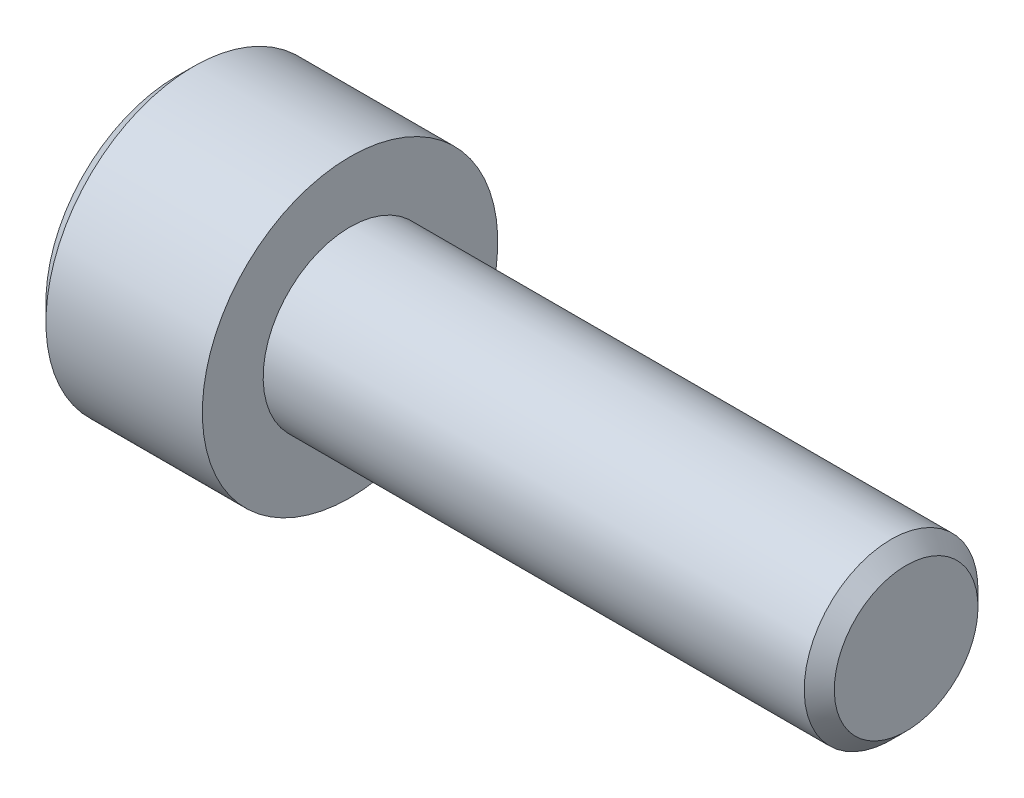
ISO-10303-21;
HEADER;
FILE_DESCRIPTION(('STEP AP214'),'2;1');
FILE_NAME('part.step','',(''),(''),'','','');
FILE_SCHEMA(('AUTOMOTIVE_DESIGN { 1 0 10303 214 1 1 1 1 }'));
ENDSEC;
DATA;
#1=APPLICATION_CONTEXT('core data for automotive mechanical design processes');
#2=APPLICATION_PROTOCOL_DEFINITION('international standard','automotive_design',2000,#1);
#3=PRODUCT_CONTEXT('',#1,'mechanical');
#4=PRODUCT('Part','Part','',(#3));
#5=PRODUCT_RELATED_PRODUCT_CATEGORY('part','',(#4));
#6=PRODUCT_DEFINITION_FORMATION('','',#4);
#7=PRODUCT_DEFINITION_CONTEXT('part definition',#1,'design');
#8=PRODUCT_DEFINITION('design','',#6,#7);
#9=PRODUCT_DEFINITION_SHAPE('','',#8);
#10=(LENGTH_UNIT() NAMED_UNIT(*) SI_UNIT(.MILLI.,.METRE.));
#11=(NAMED_UNIT(*) PLANE_ANGLE_UNIT() SI_UNIT($,.RADIAN.));
#12=(NAMED_UNIT(*) SI_UNIT($,.STERADIAN.) SOLID_ANGLE_UNIT());
#13=UNCERTAINTY_MEASURE_WITH_UNIT(LENGTH_MEASURE(1.E-05),#10,'distance_accuracy_value','');
#14=(GEOMETRIC_REPRESENTATION_CONTEXT(3) GLOBAL_UNCERTAINTY_ASSIGNED_CONTEXT((#13)) GLOBAL_UNIT_ASSIGNED_CONTEXT((#10,
#11,#12)) REPRESENTATION_CONTEXT('',''));
#15=CARTESIAN_POINT('',(0.,0.,0.));
#16=DIRECTION('',(0.,0.,1.));
#17=DIRECTION('',(1.,0.,0.));
#18=AXIS2_PLACEMENT_3D('',#15,#16,#17);
#19=CARTESIAN_POINT('',(16.,0.,0.));
#20=DIRECTION('',(1.,0.,0.));
#21=DIRECTION('',(0.,1.,0.));
#22=AXIS2_PLACEMENT_3D('',#19,#20,#21);
#23=CYLINDRICAL_SURFACE('',#22,2.5);
#24=CARTESIAN_POINT('',(0.,0.,0.));
#25=DIRECTION('',(1.,0.,0.));
#26=DIRECTION('',(0.,1.,0.));
#27=AXIS2_PLACEMENT_3D('',#24,#25,#26);
#28=CIRCLE('',#27,2.5);
#29=CARTESIAN_POINT('',(0.,2.5,0.));
#30=VERTEX_POINT('',#29);
#31=EDGE_CURVE('E142',#30,#30,#28,.T.);
#32=ORIENTED_EDGE('',*,*,#31,.T.);
#33=EDGE_LOOP('',(#32));
#34=FACE_BOUND('',#33,.T.);
#35=CARTESIAN_POINT('',(15.567,0.,0.));
#36=DIRECTION('',(1.,0.,0.));
#37=DIRECTION('',(0.,1.,0.));
#38=AXIS2_PLACEMENT_3D('',#35,#36,#37);
#39=CIRCLE('',#38,2.5);
#40=CARTESIAN_POINT('',(15.567,2.5,0.));
#41=VERTEX_POINT('',#40);
#42=EDGE_CURVE('E11',#41,#41,#39,.T.);
#43=ORIENTED_EDGE('',*,*,#42,.F.);
#44=EDGE_LOOP('',(#43));
#45=FACE_BOUND('',#44,.T.);
#46=ADVANCED_FACE('F37',(#34,#45),#23,.T.);
#47=CARTESIAN_POINT('',(16.,0.,0.));
#48=DIRECTION('',(-1.,0.,0.));
#49=DIRECTION('',(0.,-1.,0.));
#50=AXIS2_PLACEMENT_3D('',#47,#48,#49);
#51=CONICAL_SURFACE('',#50,2.067,0.785398163397449);
#52=ORIENTED_EDGE('',*,*,#42,.T.);
#53=EDGE_LOOP('',(#52));
#54=FACE_BOUND('',#53,.T.);
#55=CARTESIAN_POINT('',(16.,0.,0.));
#56=DIRECTION('',(1.,0.,0.));
#57=DIRECTION('',(0.,1.,0.));
#58=AXIS2_PLACEMENT_3D('',#55,#56,#57);
#59=CIRCLE('',#58,2.067);
#60=CARTESIAN_POINT('',(16.,2.067,0.));
#61=VERTEX_POINT('',#60);
#62=EDGE_CURVE('E50',#61,#61,#59,.T.);
#63=ORIENTED_EDGE('',*,*,#62,.F.);
#64=EDGE_LOOP('',(#63));
#65=FACE_BOUND('',#64,.T.);
#66=ADVANCED_FACE('F162',(#54,#65),#51,.T.);
#67=CARTESIAN_POINT('',(16.,2.067,0.));
#68=DIRECTION('',(1.,0.,0.));
#69=DIRECTION('',(0.,1.,0.));
#70=AXIS2_PLACEMENT_3D('',#67,#68,#69);
#71=PLANE('',#70);
#72=ORIENTED_EDGE('',*,*,#62,.T.);
#73=EDGE_LOOP('',(#72));
#74=FACE_BOUND('',#73,.T.);
#75=ADVANCED_FACE('F159',(#74),#71,.T.);
#76=CARTESIAN_POINT('',(-5.,0.,0.));
#77=DIRECTION('',(-1.,0.,0.));
#78=DIRECTION('',(0.,-1.,0.));
#79=AXIS2_PLACEMENT_3D('',#76,#77,#78);
#80=PLANE('',#79);
#81=DIRECTION('',(0.,0.5,-0.866025403784438));
#82=VECTOR('',#81,1.);
#83=CARTESIAN_POINT('',(-5.,1.15470053837925,2.));
#84=LINE('',#83,#82);
#85=CARTESIAN_POINT('',(-5.,1.15470053837925,2.));
#86=VERTEX_POINT('',#85);
#87=CARTESIAN_POINT('',(-5.,2.3094010767585,0.));
#88=VERTEX_POINT('',#87);
#89=EDGE_CURVE('E53',#86,#88,#84,.T.);
#90=ORIENTED_EDGE('',*,*,#89,.F.);
#91=DIRECTION('',(0.,1.,0.));
#92=VECTOR('',#91,1.);
#93=CARTESIAN_POINT('',(-5.,-1.15470053837925,2.));
#94=LINE('',#93,#92);
#95=CARTESIAN_POINT('',(-5.,-1.15470053837925,2.));
#96=VERTEX_POINT('',#95);
#97=EDGE_CURVE('E140',#96,#86,#94,.T.);
#98=ORIENTED_EDGE('',*,*,#97,.F.);
#99=DIRECTION('',(0.,0.5,0.866025403784439));
#100=VECTOR('',#99,1.);
#101=CARTESIAN_POINT('',(-5.,-2.3094010767585,0.));
#102=LINE('',#101,#100);
#103=CARTESIAN_POINT('',(-5.,-2.3094010767585,0.));
#104=VERTEX_POINT('',#103);
#105=EDGE_CURVE('E134',#104,#96,#102,.T.);
#106=ORIENTED_EDGE('',*,*,#105,.F.);
#107=DIRECTION('',(0.,-0.5,0.866025403784439));
#108=VECTOR('',#107,1.);
#109=CARTESIAN_POINT('',(-5.,-1.15470053837925,-2.));
#110=LINE('',#109,#108);
#111=CARTESIAN_POINT('',(-5.,-1.15470053837925,-2.));
#112=VERTEX_POINT('',#111);
#113=EDGE_CURVE('E105',#112,#104,#110,.T.);
#114=ORIENTED_EDGE('',*,*,#113,.F.);
#115=DIRECTION('',(0.,-1.,0.));
#116=VECTOR('',#115,1.);
#117=CARTESIAN_POINT('',(-5.,1.15470053837925,-2.));
#118=LINE('',#117,#116);
#119=CARTESIAN_POINT('',(-5.,1.15470053837925,-2.));
#120=VERTEX_POINT('',#119);
#121=EDGE_CURVE('E133',#120,#112,#118,.T.);
#122=ORIENTED_EDGE('',*,*,#121,.F.);
#123=DIRECTION('',(0.,-0.5,-0.866025403784439));
#124=VECTOR('',#123,1.);
#125=CARTESIAN_POINT('',(-5.,2.3094010767585,0.));
#126=LINE('',#125,#124);
#127=EDGE_CURVE('E129',#88,#120,#126,.T.);
#128=ORIENTED_EDGE('',*,*,#127,.F.);
#129=EDGE_LOOP('',(#90,#98,#106,#114,#122,#128));
#130=FACE_BOUND('',#129,.T.);
#131=CARTESIAN_POINT('',(-5.,0.,0.));
#132=DIRECTION('',(1.,0.,0.));
#133=DIRECTION('',(0.,1.,0.));
#134=AXIS2_PLACEMENT_3D('',#131,#132,#133);
#135=CIRCLE('',#134,3.75);
#136=CARTESIAN_POINT('',(-5.,3.75,0.));
#137=VERTEX_POINT('',#136);
#138=EDGE_CURVE('E154',#137,#137,#135,.T.);
#139=ORIENTED_EDGE('',*,*,#138,.F.);
#140=EDGE_LOOP('',(#139));
#141=FACE_BOUND('',#140,.T.);
#142=ADVANCED_FACE('F169',(#130,#141),#80,.T.);
#143=CARTESIAN_POINT('',(-4.5,0.,0.));
#144=DIRECTION('',(1.,0.,0.));
#145=DIRECTION('',(0.,1.,0.));
#146=AXIS2_PLACEMENT_3D('',#143,#144,#145);
#147=CONICAL_SURFACE('',#146,4.25,0.785398163397448);
#148=ORIENTED_EDGE('',*,*,#138,.T.);
#149=EDGE_LOOP('',(#148));
#150=FACE_BOUND('',#149,.T.);
#151=CARTESIAN_POINT('',(-4.5,0.,0.));
#152=DIRECTION('',(1.,0.,0.));
#153=DIRECTION('',(0.,1.,0.));
#154=AXIS2_PLACEMENT_3D('',#151,#152,#153);
#155=CIRCLE('',#154,4.25);
#156=CARTESIAN_POINT('',(-4.5,4.25,0.));
#157=VERTEX_POINT('',#156);
#158=EDGE_CURVE('E155',#157,#157,#155,.T.);
#159=ORIENTED_EDGE('',*,*,#158,.F.);
#160=EDGE_LOOP('',(#159));
#161=FACE_BOUND('',#160,.T.);
#162=ADVANCED_FACE('F176',(#150,#161),#147,.T.);
#163=CARTESIAN_POINT('',(16.,0.,0.));
#164=DIRECTION('',(1.,0.,0.));
#165=DIRECTION('',(0.,1.,0.));
#166=AXIS2_PLACEMENT_3D('',#163,#164,#165);
#167=CYLINDRICAL_SURFACE('',#166,4.25);
#168=ORIENTED_EDGE('',*,*,#158,.T.);
#169=EDGE_LOOP('',(#168));
#170=FACE_BOUND('',#169,.T.);
#171=CARTESIAN_POINT('',(0.,0.,0.));
#172=DIRECTION('',(1.,0.,0.));
#173=DIRECTION('',(0.,1.,0.));
#174=AXIS2_PLACEMENT_3D('',#171,#172,#173);
#175=CIRCLE('',#174,4.25);
#176=CARTESIAN_POINT('',(0.,4.25,0.));
#177=VERTEX_POINT('',#176);
#178=EDGE_CURVE('E146',#177,#177,#175,.T.);
#179=ORIENTED_EDGE('',*,*,#178,.F.);
#180=EDGE_LOOP('',(#179));
#181=FACE_BOUND('',#180,.T.);
#182=ADVANCED_FACE('F179',(#170,#181),#167,.T.);
#183=CARTESIAN_POINT('',(0.,2.5,0.));
#184=DIRECTION('',(1.,0.,0.));
#185=DIRECTION('',(0.,1.,0.));
#186=AXIS2_PLACEMENT_3D('',#183,#184,#185);
#187=PLANE('',#186);
#188=ORIENTED_EDGE('',*,*,#178,.T.);
#189=EDGE_LOOP('',(#188));
#190=FACE_BOUND('',#189,.T.);
#191=ORIENTED_EDGE('',*,*,#31,.F.);
#192=EDGE_LOOP('',(#191));
#193=FACE_BOUND('',#192,.T.);
#194=ADVANCED_FACE('F183',(#190,#193),#187,.T.);
#195=CARTESIAN_POINT('',(-2.5,1.15470053837925,2.));
#196=DIRECTION('',(0.,0.866025403784439,0.5));
#197=DIRECTION('',(0.,-0.5,0.866025403784439));
#198=AXIS2_PLACEMENT_3D('',#195,#196,#197);
#199=PLANE('',#198);
#200=ORIENTED_EDGE('',*,*,#89,.T.);
#201=DIRECTION('',(-1.,0.,0.));
#202=VECTOR('',#201,1.);
#203=CARTESIAN_POINT('',(-2.5,2.3094010767585,0.));
#204=LINE('',#203,#202);
#205=CARTESIAN_POINT('',(-2.5,2.3094010767585,0.));
#206=VERTEX_POINT('',#205);
#207=EDGE_CURVE('E81',#206,#88,#204,.T.);
#208=ORIENTED_EDGE('',*,*,#207,.F.);
#209=DIRECTION('',(0.,0.5,-0.866025403784438));
#210=VECTOR('',#209,1.);
#211=CARTESIAN_POINT('',(-2.5,1.15470053837925,2.));
#212=LINE('',#211,#210);
#213=CARTESIAN_POINT('',(-2.5,1.15470053837925,2.));
#214=VERTEX_POINT('',#213);
#215=EDGE_CURVE('E136',#214,#206,#212,.T.);
#216=ORIENTED_EDGE('',*,*,#215,.F.);
#217=DIRECTION('',(-1.,0.,0.));
#218=VECTOR('',#217,1.);
#219=CARTESIAN_POINT('',(-2.5,1.15470053837925,2.));
#220=LINE('',#219,#218);
#221=EDGE_CURVE('E65',#214,#86,#220,.T.);
#222=ORIENTED_EDGE('',*,*,#221,.T.);
#223=EDGE_LOOP('',(#200,#208,#216,#222));
#224=FACE_BOUND('',#223,.T.);
#225=ADVANCED_FACE('F189',(#224),#199,.F.);
#226=CARTESIAN_POINT('',(-2.5,-1.15470053837925,2.));
#227=DIRECTION('',(0.,0.,1.));
#228=DIRECTION('',(0.,-1.,0.));
#229=AXIS2_PLACEMENT_3D('',#226,#227,#228);
#230=PLANE('',#229);
#231=ORIENTED_EDGE('',*,*,#97,.T.);
#232=ORIENTED_EDGE('',*,*,#221,.F.);
#233=DIRECTION('',(0.,1.,0.));
#234=VECTOR('',#233,1.);
#235=CARTESIAN_POINT('',(-2.5,-1.15470053837925,2.));
#236=LINE('',#235,#234);
#237=CARTESIAN_POINT('',(-2.5,-1.15470053837925,2.));
#238=VERTEX_POINT('',#237);
#239=EDGE_CURVE('E112',#238,#214,#236,.T.);
#240=ORIENTED_EDGE('',*,*,#239,.F.);
#241=DIRECTION('',(-1.,0.,0.));
#242=VECTOR('',#241,1.);
#243=CARTESIAN_POINT('',(-2.5,-1.15470053837925,2.));
#244=LINE('',#243,#242);
#245=EDGE_CURVE('E106',#238,#96,#244,.T.);
#246=ORIENTED_EDGE('',*,*,#245,.T.);
#247=EDGE_LOOP('',(#231,#232,#240,#246));
#248=FACE_BOUND('',#247,.T.);
#249=ADVANCED_FACE('F195',(#248),#230,.F.);
#250=CARTESIAN_POINT('',(-2.5,-2.3094010767585,0.));
#251=DIRECTION('',(0.,-0.866025403784439,0.5));
#252=DIRECTION('',(0.,-0.5,-0.866025403784439));
#253=AXIS2_PLACEMENT_3D('',#250,#251,#252);
#254=PLANE('',#253);
#255=ORIENTED_EDGE('',*,*,#105,.T.);
#256=ORIENTED_EDGE('',*,*,#245,.F.);
#257=DIRECTION('',(0.,0.5,0.866025403784439));
#258=VECTOR('',#257,1.);
#259=CARTESIAN_POINT('',(-2.5,-2.3094010767585,0.));
#260=LINE('',#259,#258);
#261=CARTESIAN_POINT('',(-2.5,-2.3094010767585,0.));
#262=VERTEX_POINT('',#261);
#263=EDGE_CURVE('E109',#262,#238,#260,.T.);
#264=ORIENTED_EDGE('',*,*,#263,.F.);
#265=DIRECTION('',(-1.,0.,0.));
#266=VECTOR('',#265,1.);
#267=CARTESIAN_POINT('',(-2.5,-2.3094010767585,0.));
#268=LINE('',#267,#266);
#269=EDGE_CURVE('E94',#262,#104,#268,.T.);
#270=ORIENTED_EDGE('',*,*,#269,.T.);
#271=EDGE_LOOP('',(#255,#256,#264,#270));
#272=FACE_BOUND('',#271,.T.);
#273=ADVANCED_FACE('F111',(#272),#254,.F.);
#274=CARTESIAN_POINT('',(-2.5,-1.15470053837925,-2.));
#275=DIRECTION('',(0.,-0.866025403784439,-0.5));
#276=DIRECTION('',(0.,0.5,-0.866025403784439));
#277=AXIS2_PLACEMENT_3D('',#274,#275,#276);
#278=PLANE('',#277);
#279=ORIENTED_EDGE('',*,*,#113,.T.);
#280=ORIENTED_EDGE('',*,*,#269,.F.);
#281=DIRECTION('',(0.,-0.5,0.866025403784439));
#282=VECTOR('',#281,1.);
#283=CARTESIAN_POINT('',(-2.5,-1.15470053837925,-2.));
#284=LINE('',#283,#282);
#285=CARTESIAN_POINT('',(-2.5,-1.15470053837925,-2.));
#286=VERTEX_POINT('',#285);
#287=EDGE_CURVE('E100',#286,#262,#284,.T.);
#288=ORIENTED_EDGE('',*,*,#287,.F.);
#289=DIRECTION('',(-1.,0.,0.));
#290=VECTOR('',#289,1.);
#291=CARTESIAN_POINT('',(-2.5,-1.15470053837925,-2.));
#292=LINE('',#291,#290);
#293=EDGE_CURVE('E110',#286,#112,#292,.T.);
#294=ORIENTED_EDGE('',*,*,#293,.T.);
#295=EDGE_LOOP('',(#279,#280,#288,#294));
#296=FACE_BOUND('',#295,.T.);
#297=ADVANCED_FACE('F97',(#296),#278,.F.);
#298=CARTESIAN_POINT('',(-2.5,1.15470053837925,-2.));
#299=DIRECTION('',(0.,0.,-1.));
#300=DIRECTION('',(-1.,0.,0.));
#301=AXIS2_PLACEMENT_3D('',#298,#299,#300);
#302=PLANE('',#301);
#303=ORIENTED_EDGE('',*,*,#121,.T.);
#304=ORIENTED_EDGE('',*,*,#293,.F.);
#305=DIRECTION('',(0.,-1.,0.));
#306=VECTOR('',#305,1.);
#307=CARTESIAN_POINT('',(-2.5,1.15470053837925,-2.));
#308=LINE('',#307,#306);
#309=CARTESIAN_POINT('',(-2.5,1.15470053837925,-2.));
#310=VERTEX_POINT('',#309);
#311=EDGE_CURVE('E119',#310,#286,#308,.T.);
#312=ORIENTED_EDGE('',*,*,#311,.F.);
#313=DIRECTION('',(-1.,0.,0.));
#314=VECTOR('',#313,1.);
#315=CARTESIAN_POINT('',(-2.5,1.15470053837925,-2.));
#316=LINE('',#315,#314);
#317=EDGE_CURVE('E144',#310,#120,#316,.T.);
#318=ORIENTED_EDGE('',*,*,#317,.T.);
#319=EDGE_LOOP('',(#303,#304,#312,#318));
#320=FACE_BOUND('',#319,.T.);
#321=ADVANCED_FACE('F198',(#320),#302,.F.);
#322=CARTESIAN_POINT('',(-2.5,2.3094010767585,0.));
#323=DIRECTION('',(0.,0.866025403784439,-0.5));
#324=DIRECTION('',(0.,0.5,0.866025403784439));
#325=AXIS2_PLACEMENT_3D('',#322,#323,#324);
#326=PLANE('',#325);
#327=ORIENTED_EDGE('',*,*,#127,.T.);
#328=ORIENTED_EDGE('',*,*,#317,.F.);
#329=DIRECTION('',(0.,-0.5,-0.866025403784439));
#330=VECTOR('',#329,1.);
#331=CARTESIAN_POINT('',(-2.5,2.3094010767585,0.));
#332=LINE('',#331,#330);
#333=EDGE_CURVE('E125',#206,#310,#332,.T.);
#334=ORIENTED_EDGE('',*,*,#333,.F.);
#335=ORIENTED_EDGE('',*,*,#207,.T.);
#336=EDGE_LOOP('',(#327,#328,#334,#335));
#337=FACE_BOUND('',#336,.T.);
#338=ADVANCED_FACE('F194',(#337),#326,.F.);
#339=CARTESIAN_POINT('',(-2.5,0.,0.));
#340=DIRECTION('',(-1.,0.,0.));
#341=DIRECTION('',(0.,0.,1.));
#342=AXIS2_PLACEMENT_3D('',#339,#340,#341);
#343=PLANE('',#342);
#344=ORIENTED_EDGE('',*,*,#215,.T.);
#345=ORIENTED_EDGE('',*,*,#333,.T.);
#346=ORIENTED_EDGE('',*,*,#311,.T.);
#347=ORIENTED_EDGE('',*,*,#287,.T.);
#348=ORIENTED_EDGE('',*,*,#263,.T.);
#349=ORIENTED_EDGE('',*,*,#239,.T.);
#350=EDGE_LOOP('',(#344,#345,#346,#347,#348,#349));
#351=FACE_BOUND('',#350,.T.);
#352=ADVANCED_FACE('F120',(#351),#343,.T.);
#353=CLOSED_SHELL('',(#46,#66,#75,#142,#162,#182,#194,#225,#249,#273,#297,#321,#338,#352));
#354=MANIFOLD_SOLID_BREP('B2',#353);
#355=ADVANCED_BREP_SHAPE_REPRESENTATION('',(#18,#354),#14);
#356=SHAPE_DEFINITION_REPRESENTATION(#9,#355);
ENDSEC;
END-ISO-10303-21;
